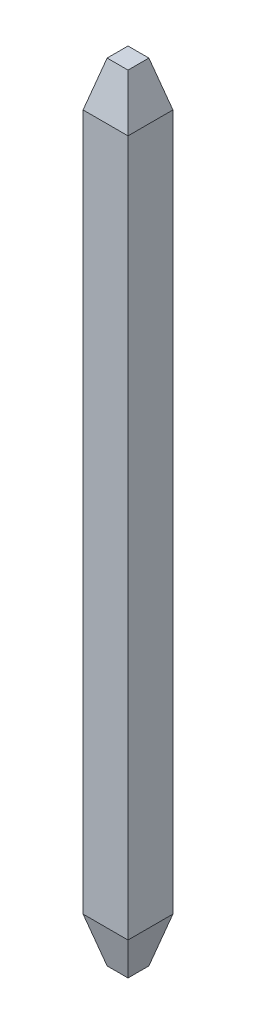
ISO-10303-21;
HEADER;
FILE_DESCRIPTION(('STEP AP214'),'2;1');
FILE_NAME('part.step','',(''),(''),'','','');
FILE_SCHEMA(('AUTOMOTIVE_DESIGN { 1 0 10303 214 1 1 1 1 }'));
ENDSEC;
DATA;
#1=APPLICATION_CONTEXT('core data for automotive mechanical design processes');
#2=APPLICATION_PROTOCOL_DEFINITION('international standard','automotive_design',2000,#1);
#3=PRODUCT_CONTEXT('',#1,'mechanical');
#4=PRODUCT('Part','Part','',(#3));
#5=PRODUCT_RELATED_PRODUCT_CATEGORY('part','',(#4));
#6=PRODUCT_DEFINITION_FORMATION('','',#4);
#7=PRODUCT_DEFINITION_CONTEXT('part definition',#1,'design');
#8=PRODUCT_DEFINITION('design','',#6,#7);
#9=PRODUCT_DEFINITION_SHAPE('','',#8);
#10=(LENGTH_UNIT() NAMED_UNIT(*) SI_UNIT(.MILLI.,.METRE.));
#11=(NAMED_UNIT(*) PLANE_ANGLE_UNIT() SI_UNIT($,.RADIAN.));
#12=(NAMED_UNIT(*) SI_UNIT($,.STERADIAN.) SOLID_ANGLE_UNIT());
#13=UNCERTAINTY_MEASURE_WITH_UNIT(LENGTH_MEASURE(1.E-05),#10,'distance_accuracy_value','');
#14=(GEOMETRIC_REPRESENTATION_CONTEXT(3) GLOBAL_UNCERTAINTY_ASSIGNED_CONTEXT((#13)) GLOBAL_UNIT_ASSIGNED_CONTEXT((#10,
#11,#12)) REPRESENTATION_CONTEXT('',''));
#15=CARTESIAN_POINT('',(0.,0.,0.));
#16=DIRECTION('',(0.,0.,1.));
#17=DIRECTION('',(1.,0.,0.));
#18=AXIS2_PLACEMENT_3D('',#15,#16,#17);
#19=CARTESIAN_POINT('',(0.2,3.5,0.2));
#20=DIRECTION('',(-1.,0.,0.));
#21=DIRECTION('',(0.,0.,1.));
#22=AXIS2_PLACEMENT_3D('',#19,#20,#21);
#23=PLANE('',#22);
#24=DIRECTION('',(0.,-1.,0.));
#25=VECTOR('',#24,1.);
#26=CARTESIAN_POINT('',(0.2,3.5,0.2));
#27=LINE('',#26,#25);
#28=CARTESIAN_POINT('',(0.2,3.09999999999999,0.2));
#29=VERTEX_POINT('',#28);
#30=CARTESIAN_POINT('',(0.2,-3.09999999999999,0.2));
#31=VERTEX_POINT('',#30);
#32=EDGE_CURVE('E143',#29,#31,#27,.T.);
#33=ORIENTED_EDGE('',*,*,#32,.T.);
#34=DIRECTION('',(0.,0.,-1.));
#35=VECTOR('',#34,1.);
#36=CARTESIAN_POINT('',(0.2,-3.09999999999999,-0.2));
#37=LINE('',#36,#35);
#38=CARTESIAN_POINT('',(0.2,-3.09999999999999,-0.2));
#39=VERTEX_POINT('',#38);
#40=EDGE_CURVE('E11',#31,#39,#37,.T.);
#41=ORIENTED_EDGE('',*,*,#40,.T.);
#42=DIRECTION('',(0.,-1.,0.));
#43=VECTOR('',#42,1.);
#44=CARTESIAN_POINT('',(0.2,3.5,-0.2));
#45=LINE('',#44,#43);
#46=CARTESIAN_POINT('',(0.2,3.09999999999999,-0.2));
#47=VERTEX_POINT('',#46);
#48=EDGE_CURVE('E120',#47,#39,#45,.T.);
#49=ORIENTED_EDGE('',*,*,#48,.F.);
#50=DIRECTION('',(0.,0.,1.));
#51=VECTOR('',#50,1.);
#52=CARTESIAN_POINT('',(0.2,3.09999999999999,0.2));
#53=LINE('',#52,#51);
#54=EDGE_CURVE('E133',#47,#29,#53,.T.);
#55=ORIENTED_EDGE('',*,*,#54,.T.);
#56=EDGE_LOOP('',(#33,#41,#49,#55));
#57=FACE_BOUND('',#56,.T.);
#58=ADVANCED_FACE('F33',(#57),#23,.F.);
#59=CARTESIAN_POINT('',(-0.2,3.5,-0.2));
#60=DIRECTION('',(0.,0.,1.));
#61=DIRECTION('',(1.,0.,0.));
#62=AXIS2_PLACEMENT_3D('',#59,#60,#61);
#63=PLANE('',#62);
#64=ORIENTED_EDGE('',*,*,#48,.T.);
#65=DIRECTION('',(-1.,0.,0.));
#66=VECTOR('',#65,1.);
#67=CARTESIAN_POINT('',(-0.2,-3.09999999999999,-0.2));
#68=LINE('',#67,#66);
#69=CARTESIAN_POINT('',(-0.2,-3.09999999999999,-0.2));
#70=VERTEX_POINT('',#69);
#71=EDGE_CURVE('E42',#39,#70,#68,.T.);
#72=ORIENTED_EDGE('',*,*,#71,.T.);
#73=DIRECTION('',(0.,-1.,0.));
#74=VECTOR('',#73,1.);
#75=CARTESIAN_POINT('',(-0.2,3.5,-0.2));
#76=LINE('',#75,#74);
#77=CARTESIAN_POINT('',(-0.2,3.09999999999999,-0.2));
#78=VERTEX_POINT('',#77);
#79=EDGE_CURVE('E191',#78,#70,#76,.T.);
#80=ORIENTED_EDGE('',*,*,#79,.F.);
#81=DIRECTION('',(1.,0.,0.));
#82=VECTOR('',#81,1.);
#83=CARTESIAN_POINT('',(-0.2,3.09999999999999,-0.2));
#84=LINE('',#83,#82);
#85=EDGE_CURVE('E127',#78,#47,#84,.T.);
#86=ORIENTED_EDGE('',*,*,#85,.T.);
#87=EDGE_LOOP('',(#64,#72,#80,#86));
#88=FACE_BOUND('',#87,.T.);
#89=ADVANCED_FACE('F203',(#88),#63,.F.);
#90=CARTESIAN_POINT('',(-0.2,3.5,0.2));
#91=DIRECTION('',(1.,0.,0.));
#92=DIRECTION('',(0.,0.,-1.));
#93=AXIS2_PLACEMENT_3D('',#90,#91,#92);
#94=PLANE('',#93);
#95=ORIENTED_EDGE('',*,*,#79,.T.);
#96=DIRECTION('',(0.,0.,1.));
#97=VECTOR('',#96,1.);
#98=CARTESIAN_POINT('',(-0.2,-3.09999999999999,0.2));
#99=LINE('',#98,#97);
#100=CARTESIAN_POINT('',(-0.2,-3.09999999999999,0.2));
#101=VERTEX_POINT('',#100);
#102=EDGE_CURVE('E155',#70,#101,#99,.T.);
#103=ORIENTED_EDGE('',*,*,#102,.T.);
#104=DIRECTION('',(0.,-1.,0.));
#105=VECTOR('',#104,1.);
#106=CARTESIAN_POINT('',(-0.2,3.5,0.2));
#107=LINE('',#106,#105);
#108=CARTESIAN_POINT('',(-0.2,3.09999999999999,0.2));
#109=VERTEX_POINT('',#108);
#110=EDGE_CURVE('E188',#109,#101,#107,.T.);
#111=ORIENTED_EDGE('',*,*,#110,.F.);
#112=DIRECTION('',(0.,0.,-1.));
#113=VECTOR('',#112,1.);
#114=CARTESIAN_POINT('',(-0.2,3.09999999999999,0.2));
#115=LINE('',#114,#113);
#116=EDGE_CURVE('E107',#109,#78,#115,.T.);
#117=ORIENTED_EDGE('',*,*,#116,.T.);
#118=EDGE_LOOP('',(#95,#103,#111,#117));
#119=FACE_BOUND('',#118,.T.);
#120=ADVANCED_FACE('F202',(#119),#94,.F.);
#121=CARTESIAN_POINT('',(-0.2,3.5,0.2));
#122=DIRECTION('',(0.,0.,-1.));
#123=DIRECTION('',(-1.,0.,0.));
#124=AXIS2_PLACEMENT_3D('',#121,#122,#123);
#125=PLANE('',#124);
#126=ORIENTED_EDGE('',*,*,#110,.T.);
#127=DIRECTION('',(1.,0.,0.));
#128=VECTOR('',#127,1.);
#129=CARTESIAN_POINT('',(0.2,-3.09999999999999,0.2));
#130=LINE('',#129,#128);
#131=EDGE_CURVE('E136',#101,#31,#130,.T.);
#132=ORIENTED_EDGE('',*,*,#131,.T.);
#133=ORIENTED_EDGE('',*,*,#32,.F.);
#134=DIRECTION('',(-1.,0.,0.));
#135=VECTOR('',#134,1.);
#136=CARTESIAN_POINT('',(-0.2,3.09999999999999,0.2));
#137=LINE('',#136,#135);
#138=EDGE_CURVE('E135',#29,#109,#137,.T.);
#139=ORIENTED_EDGE('',*,*,#138,.T.);
#140=EDGE_LOOP('',(#126,#132,#133,#139));
#141=FACE_BOUND('',#140,.T.);
#142=ADVANCED_FACE('F186',(#141),#125,.F.);
#143=CARTESIAN_POINT('',(0.,3.5,0.));
#144=DIRECTION('',(0.,-1.,0.));
#145=DIRECTION('',(0.,0.,-1.));
#146=AXIS2_PLACEMENT_3D('',#143,#144,#145);
#147=PLANE('',#146);
#148=DIRECTION('',(-1.,0.,0.));
#149=VECTOR('',#148,1.);
#150=CARTESIAN_POINT('',(0.,3.5,-0.0928203230275505));
#151=LINE('',#150,#149);
#152=CARTESIAN_POINT('',(0.0928203230275505,3.5,-0.0928203230275505));
#153=VERTEX_POINT('',#152);
#154=CARTESIAN_POINT('',(-0.0928203230275506,3.5,-0.0928203230275505));
#155=VERTEX_POINT('',#154);
#156=EDGE_CURVE('E124',#153,#155,#151,.T.);
#157=ORIENTED_EDGE('',*,*,#156,.T.);
#158=DIRECTION('',(0.,0.,1.));
#159=VECTOR('',#158,1.);
#160=CARTESIAN_POINT('',(-0.0928203230275506,3.5,0.));
#161=LINE('',#160,#159);
#162=CARTESIAN_POINT('',(-0.0928203230275506,3.5,0.0928203230275506));
#163=VERTEX_POINT('',#162);
#164=EDGE_CURVE('E105',#155,#163,#161,.T.);
#165=ORIENTED_EDGE('',*,*,#164,.T.);
#166=DIRECTION('',(1.,0.,0.));
#167=VECTOR('',#166,1.);
#168=CARTESIAN_POINT('',(0.,3.5,0.0928203230275506));
#169=LINE('',#168,#167);
#170=CARTESIAN_POINT('',(0.0928203230275505,3.5,0.0928203230275506));
#171=VERTEX_POINT('',#170);
#172=EDGE_CURVE('E113',#163,#171,#169,.T.);
#173=ORIENTED_EDGE('',*,*,#172,.T.);
#174=DIRECTION('',(0.,0.,-1.));
#175=VECTOR('',#174,1.);
#176=CARTESIAN_POINT('',(0.0928203230275505,3.5,0.));
#177=LINE('',#176,#175);
#178=EDGE_CURVE('E119',#171,#153,#177,.T.);
#179=ORIENTED_EDGE('',*,*,#178,.T.);
#180=EDGE_LOOP('',(#157,#165,#173,#179));
#181=FACE_BOUND('',#180,.T.);
#182=ADVANCED_FACE('F122',(#181),#147,.F.);
#183=CARTESIAN_POINT('',(0.,-3.5,0.));
#184=DIRECTION('',(0.,-1.,0.));
#185=DIRECTION('',(0.,0.,-1.));
#186=AXIS2_PLACEMENT_3D('',#183,#184,#185);
#187=PLANE('',#186);
#188=DIRECTION('',(0.,0.,1.));
#189=VECTOR('',#188,1.);
#190=CARTESIAN_POINT('',(0.0928203230275505,-3.5,0.2));
#191=LINE('',#190,#189);
#192=CARTESIAN_POINT('',(0.0928203230275505,-3.5,-0.0928203230275505));
#193=VERTEX_POINT('',#192);
#194=CARTESIAN_POINT('',(0.0928203230275505,-3.5,0.0928203230275506));
#195=VERTEX_POINT('',#194);
#196=EDGE_CURVE('E146',#193,#195,#191,.T.);
#197=ORIENTED_EDGE('',*,*,#196,.T.);
#198=DIRECTION('',(-1.,0.,0.));
#199=VECTOR('',#198,1.);
#200=CARTESIAN_POINT('',(-0.2,-3.5,0.0928203230275506));
#201=LINE('',#200,#199);
#202=CARTESIAN_POINT('',(-0.0928203230275506,-3.5,0.0928203230275506));
#203=VERTEX_POINT('',#202);
#204=EDGE_CURVE('E152',#195,#203,#201,.T.);
#205=ORIENTED_EDGE('',*,*,#204,.T.);
#206=DIRECTION('',(0.,0.,-1.));
#207=VECTOR('',#206,1.);
#208=CARTESIAN_POINT('',(-0.0928203230275506,-3.5,-0.2));
#209=LINE('',#208,#207);
#210=CARTESIAN_POINT('',(-0.0928203230275506,-3.5,-0.0928203230275505));
#211=VERTEX_POINT('',#210);
#212=EDGE_CURVE('E150',#203,#211,#209,.T.);
#213=ORIENTED_EDGE('',*,*,#212,.T.);
#214=DIRECTION('',(1.,0.,0.));
#215=VECTOR('',#214,1.);
#216=CARTESIAN_POINT('',(0.2,-3.5,-0.0928203230275505));
#217=LINE('',#216,#215);
#218=EDGE_CURVE('E148',#211,#193,#217,.T.);
#219=ORIENTED_EDGE('',*,*,#218,.T.);
#220=EDGE_LOOP('',(#197,#205,#213,#219));
#221=FACE_BOUND('',#220,.T.);
#222=ADVANCED_FACE('F176',(#221),#187,.T.);
#223=CARTESIAN_POINT('',(0.0928203230275505,3.5,0.));
#224=DIRECTION('',(-0.965925826289069,-0.258819045102518,0.));
#225=DIRECTION('',(0.,0.,-1.));
#226=AXIS2_PLACEMENT_3D('',#223,#224,#225);
#227=PLANE('',#226);
#228=DIRECTION('',(-0.250562807085729,0.935113126531031,-0.250562807085729));
#229=VECTOR('',#228,1.);
#230=CARTESIAN_POINT('',(0.086992903469573,3.52174822586739,0.086992903469573));
#231=LINE('',#230,#229);
#232=EDGE_CURVE('E116',#29,#171,#231,.T.);
#233=ORIENTED_EDGE('',*,*,#232,.F.);
#234=ORIENTED_EDGE('',*,*,#54,.F.);
#235=DIRECTION('',(-0.250562807085729,0.935113126531031,0.250562807085729));
#236=VECTOR('',#235,1.);
#237=CARTESIAN_POINT('',(0.086992903469573,3.52174822586739,-0.086992903469573));
#238=LINE('',#237,#236);
#239=EDGE_CURVE('E140',#153,#47,#238,.F.);
#240=ORIENTED_EDGE('',*,*,#239,.F.);
#241=ORIENTED_EDGE('',*,*,#178,.F.);
#242=EDGE_LOOP('',(#233,#234,#240,#241));
#243=FACE_BOUND('',#242,.T.);
#244=ADVANCED_FACE('F197',(#243),#227,.F.);
#245=CARTESIAN_POINT('',(0.,3.5,-0.0928203230275505));
#246=DIRECTION('',(0.,-0.258819045102518,0.965925826289069));
#247=DIRECTION('',(-1.,0.,0.));
#248=AXIS2_PLACEMENT_3D('',#245,#246,#247);
#249=PLANE('',#248);
#250=ORIENTED_EDGE('',*,*,#239,.T.);
#251=ORIENTED_EDGE('',*,*,#85,.F.);
#252=DIRECTION('',(0.250562807085729,0.935113126531031,0.250562807085729));
#253=VECTOR('',#252,1.);
#254=CARTESIAN_POINT('',(-0.0869929034695731,3.52174822586739,-0.086992903469573));
#255=LINE('',#254,#253);
#256=EDGE_CURVE('E110',#155,#78,#255,.F.);
#257=ORIENTED_EDGE('',*,*,#256,.F.);
#258=ORIENTED_EDGE('',*,*,#156,.F.);
#259=EDGE_LOOP('',(#250,#251,#257,#258));
#260=FACE_BOUND('',#259,.T.);
#261=ADVANCED_FACE('F200',(#260),#249,.F.);
#262=CARTESIAN_POINT('',(0.,3.5,0.0928203230275506));
#263=DIRECTION('',(0.,-0.258819045102518,-0.965925826289069));
#264=DIRECTION('',(1.,0.,0.));
#265=AXIS2_PLACEMENT_3D('',#262,#263,#264);
#266=PLANE('',#265);
#267=ORIENTED_EDGE('',*,*,#232,.T.);
#268=ORIENTED_EDGE('',*,*,#172,.F.);
#269=DIRECTION('',(-0.250562807085729,-0.935113126531031,0.250562807085729));
#270=VECTOR('',#269,1.);
#271=CARTESIAN_POINT('',(-0.0869929034695731,3.52174822586739,0.086992903469573));
#272=LINE('',#271,#270);
#273=EDGE_CURVE('E101',#109,#163,#272,.F.);
#274=ORIENTED_EDGE('',*,*,#273,.F.);
#275=ORIENTED_EDGE('',*,*,#138,.F.);
#276=EDGE_LOOP('',(#267,#268,#274,#275));
#277=FACE_BOUND('',#276,.T.);
#278=ADVANCED_FACE('F114',(#277),#266,.F.);
#279=CARTESIAN_POINT('',(-0.0928203230275506,3.5,0.));
#280=DIRECTION('',(0.965925826289069,-0.258819045102518,0.));
#281=DIRECTION('',(0.,0.,1.));
#282=AXIS2_PLACEMENT_3D('',#279,#280,#281);
#283=PLANE('',#282);
#284=ORIENTED_EDGE('',*,*,#256,.T.);
#285=ORIENTED_EDGE('',*,*,#116,.F.);
#286=ORIENTED_EDGE('',*,*,#273,.T.);
#287=ORIENTED_EDGE('',*,*,#164,.F.);
#288=EDGE_LOOP('',(#284,#285,#286,#287));
#289=FACE_BOUND('',#288,.T.);
#290=ADVANCED_FACE('F103',(#289),#283,.F.);
#291=CARTESIAN_POINT('',(-0.2,-3.09999999999999,-0.2));
#292=DIRECTION('',(0.,-0.258819045102518,-0.965925826289069));
#293=DIRECTION('',(1.,0.,0.));
#294=AXIS2_PLACEMENT_3D('',#291,#292,#293);
#295=PLANE('',#294);
#296=DIRECTION('',(0.250562807085729,0.935113126531031,-0.250562807085729));
#297=VECTOR('',#296,1.);
#298=CARTESIAN_POINT('',(0.174887311882128,-3.19372182797052,-0.174887311882128));
#299=LINE('',#298,#297);
#300=EDGE_CURVE('E161',#193,#39,#299,.T.);
#301=ORIENTED_EDGE('',*,*,#300,.F.);
#302=ORIENTED_EDGE('',*,*,#218,.F.);
#303=DIRECTION('',(-0.250562807085729,0.935113126531031,-0.250562807085729));
#304=VECTOR('',#303,1.);
#305=CARTESIAN_POINT('',(-0.2,-3.09999999999999,-0.2));
#306=LINE('',#305,#304);
#307=EDGE_CURVE('E37',#70,#211,#306,.F.);
#308=ORIENTED_EDGE('',*,*,#307,.F.);
#309=ORIENTED_EDGE('',*,*,#71,.F.);
#310=EDGE_LOOP('',(#301,#302,#308,#309));
#311=FACE_BOUND('',#310,.T.);
#312=ADVANCED_FACE('F35',(#311),#295,.T.);
#313=CARTESIAN_POINT('',(-0.2,-3.09999999999999,0.2));
#314=DIRECTION('',(-0.965925826289069,-0.258819045102518,0.));
#315=DIRECTION('',(0.,0.,-1.));
#316=AXIS2_PLACEMENT_3D('',#313,#314,#315);
#317=PLANE('',#316);
#318=ORIENTED_EDGE('',*,*,#307,.T.);
#319=ORIENTED_EDGE('',*,*,#212,.F.);
#320=DIRECTION('',(-0.250562807085729,0.935113126531031,0.250562807085729));
#321=VECTOR('',#320,1.);
#322=CARTESIAN_POINT('',(-0.2,-3.09999999999999,0.2));
#323=LINE('',#322,#321);
#324=EDGE_CURVE('E160',#101,#203,#323,.F.);
#325=ORIENTED_EDGE('',*,*,#324,.F.);
#326=ORIENTED_EDGE('',*,*,#102,.F.);
#327=EDGE_LOOP('',(#318,#319,#325,#326));
#328=FACE_BOUND('',#327,.T.);
#329=ADVANCED_FACE('F171',(#328),#317,.T.);
#330=CARTESIAN_POINT('',(0.2,-3.09999999999999,0.2));
#331=DIRECTION('',(0.965925826289069,-0.258819045102518,0.));
#332=DIRECTION('',(0.,0.,1.));
#333=AXIS2_PLACEMENT_3D('',#330,#331,#332);
#334=PLANE('',#333);
#335=ORIENTED_EDGE('',*,*,#300,.T.);
#336=ORIENTED_EDGE('',*,*,#40,.F.);
#337=DIRECTION('',(-0.250562807085729,-0.935113126531031,-0.250562807085729));
#338=VECTOR('',#337,1.);
#339=CARTESIAN_POINT('',(0.2,-3.09999999999999,0.2));
#340=LINE('',#339,#338);
#341=EDGE_CURVE('E158',#195,#31,#340,.F.);
#342=ORIENTED_EDGE('',*,*,#341,.F.);
#343=ORIENTED_EDGE('',*,*,#196,.F.);
#344=EDGE_LOOP('',(#335,#336,#342,#343));
#345=FACE_BOUND('',#344,.T.);
#346=ADVANCED_FACE('F182',(#345),#334,.T.);
#347=CARTESIAN_POINT('',(-0.2,-3.09999999999999,0.2));
#348=DIRECTION('',(0.,-0.258819045102518,0.965925826289069));
#349=DIRECTION('',(-1.,0.,0.));
#350=AXIS2_PLACEMENT_3D('',#347,#348,#349);
#351=PLANE('',#350);
#352=ORIENTED_EDGE('',*,*,#324,.T.);
#353=ORIENTED_EDGE('',*,*,#204,.F.);
#354=ORIENTED_EDGE('',*,*,#341,.T.);
#355=ORIENTED_EDGE('',*,*,#131,.F.);
#356=EDGE_LOOP('',(#352,#353,#354,#355));
#357=FACE_BOUND('',#356,.T.);
#358=ADVANCED_FACE('F180',(#357),#351,.T.);
#359=CLOSED_SHELL('',(#58,#89,#120,#142,#182,#222,#244,#261,#278,#290,#312,#329,#346,#358));
#360=MANIFOLD_SOLID_BREP('B2',#359);
#361=ADVANCED_BREP_SHAPE_REPRESENTATION('',(#18,#360),#14);
#362=SHAPE_DEFINITION_REPRESENTATION(#9,#361);
ENDSEC;
END-ISO-10303-21;
